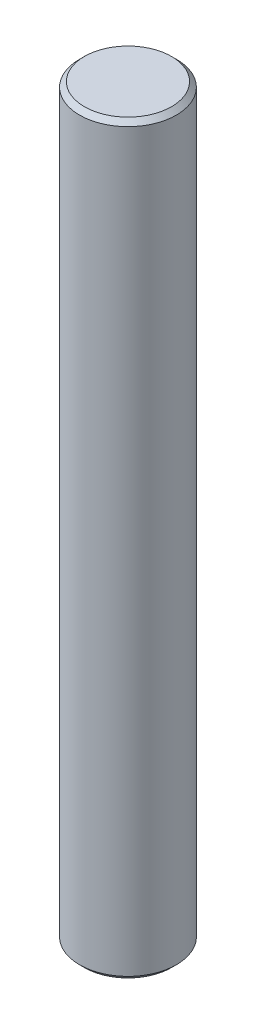
ISO-10303-21;
HEADER;
FILE_DESCRIPTION(('STEP AP214'),'2;1');
FILE_NAME('part.step','',(''),(''),'','','');
FILE_SCHEMA(('AUTOMOTIVE_DESIGN { 1 0 10303 214 1 1 1 1 }'));
ENDSEC;
DATA;
#1=APPLICATION_CONTEXT('core data for automotive mechanical design processes');
#2=APPLICATION_PROTOCOL_DEFINITION('international standard','automotive_design',2000,#1);
#3=PRODUCT_CONTEXT('',#1,'mechanical');
#4=PRODUCT('Part','Part','',(#3));
#5=PRODUCT_RELATED_PRODUCT_CATEGORY('part','',(#4));
#6=PRODUCT_DEFINITION_FORMATION('','',#4);
#7=PRODUCT_DEFINITION_CONTEXT('part definition',#1,'design');
#8=PRODUCT_DEFINITION('design','',#6,#7);
#9=PRODUCT_DEFINITION_SHAPE('','',#8);
#10=(LENGTH_UNIT() NAMED_UNIT(*) SI_UNIT(.MILLI.,.METRE.));
#11=(NAMED_UNIT(*) PLANE_ANGLE_UNIT() SI_UNIT($,.RADIAN.));
#12=(NAMED_UNIT(*) SI_UNIT($,.STERADIAN.) SOLID_ANGLE_UNIT());
#13=UNCERTAINTY_MEASURE_WITH_UNIT(LENGTH_MEASURE(1.E-05),#10,'distance_accuracy_value','');
#14=(GEOMETRIC_REPRESENTATION_CONTEXT(3) GLOBAL_UNCERTAINTY_ASSIGNED_CONTEXT((#13)) GLOBAL_UNIT_ASSIGNED_CONTEXT((#10,
#11,#12)) REPRESENTATION_CONTEXT('',''));
#15=CARTESIAN_POINT('',(0.,0.,0.));
#16=DIRECTION('',(0.,0.,1.));
#17=DIRECTION('',(1.,0.,0.));
#18=AXIS2_PLACEMENT_3D('',#15,#16,#17);
#19=CARTESIAN_POINT('',(0.,195.58,0.));
#20=DIRECTION('',(0.,-1.,0.));
#21=DIRECTION('',(0.,0.,-1.));
#22=AXIS2_PLACEMENT_3D('',#19,#20,#21);
#23=CYLINDRICAL_SURFACE('',#22,12.7);
#24=CARTESIAN_POINT('',(0.,194.31,0.));
#25=DIRECTION('',(0.,1.,0.));
#26=DIRECTION('',(0.,0.,1.));
#27=AXIS2_PLACEMENT_3D('',#24,#25,#26);
#28=CIRCLE('',#27,12.7);
#29=CARTESIAN_POINT('',(0.,194.31,12.7));
#30=VERTEX_POINT('',#29);
#31=EDGE_CURVE('E44',#30,#30,#28,.F.);
#32=ORIENTED_EDGE('',*,*,#31,.T.);
#33=EDGE_LOOP('',(#32));
#34=FACE_BOUND('',#33,.T.);
#35=CARTESIAN_POINT('',(0.,1.26999999999999,0.));
#36=DIRECTION('',(0.,1.,0.));
#37=DIRECTION('',(0.,0.,1.));
#38=AXIS2_PLACEMENT_3D('',#35,#36,#37);
#39=CIRCLE('',#38,12.7);
#40=CARTESIAN_POINT('',(0.,1.26999999999999,12.7));
#41=VERTEX_POINT('',#40);
#42=EDGE_CURVE('E48',#41,#41,#39,.T.);
#43=ORIENTED_EDGE('',*,*,#42,.T.);
#44=EDGE_LOOP('',(#43));
#45=FACE_BOUND('',#44,.T.);
#46=ADVANCED_FACE('F36',(#34,#45),#23,.T.);
#47=CARTESIAN_POINT('',(0.,195.58,0.));
#48=DIRECTION('',(0.,1.,0.));
#49=DIRECTION('',(0.,0.,1.));
#50=AXIS2_PLACEMENT_3D('',#47,#48,#49);
#51=PLANE('',#50);
#52=CARTESIAN_POINT('',(0.,195.58,0.));
#53=DIRECTION('',(0.,1.,0.));
#54=DIRECTION('',(0.,0.,1.));
#55=AXIS2_PLACEMENT_3D('',#52,#53,#54);
#56=CIRCLE('',#55,11.43);
#57=CARTESIAN_POINT('',(0.,195.58,11.43));
#58=VERTEX_POINT('',#57);
#59=EDGE_CURVE('E52',#58,#58,#56,.T.);
#60=ORIENTED_EDGE('',*,*,#59,.T.);
#61=EDGE_LOOP('',(#60));
#62=FACE_BOUND('',#61,.T.);
#63=ADVANCED_FACE('F58',(#62),#51,.T.);
#64=CARTESIAN_POINT('',(0.,0.,0.));
#65=DIRECTION('',(0.,1.,0.));
#66=DIRECTION('',(0.,0.,1.));
#67=AXIS2_PLACEMENT_3D('',#64,#65,#66);
#68=PLANE('',#67);
#69=CARTESIAN_POINT('',(0.,0.,0.));
#70=DIRECTION('',(0.,1.,0.));
#71=DIRECTION('',(0.,0.,1.));
#72=AXIS2_PLACEMENT_3D('',#69,#70,#71);
#73=CIRCLE('',#72,11.43);
#74=CARTESIAN_POINT('',(0.,0.,11.43));
#75=VERTEX_POINT('',#74);
#76=EDGE_CURVE('E10',#75,#75,#73,.F.);
#77=ORIENTED_EDGE('',*,*,#76,.T.);
#78=EDGE_LOOP('',(#77));
#79=FACE_BOUND('',#78,.T.);
#80=ADVANCED_FACE('F62',(#79),#68,.F.);
#81=CARTESIAN_POINT('',(0.,195.58,0.));
#82=DIRECTION('',(0.,-1.,0.));
#83=DIRECTION('',(0.,0.,-1.));
#84=AXIS2_PLACEMENT_3D('',#81,#82,#83);
#85=CONICAL_SURFACE('',#84,11.43,0.785398163397442);
#86=ORIENTED_EDGE('',*,*,#31,.F.);
#87=EDGE_LOOP('',(#86));
#88=FACE_BOUND('',#87,.T.);
#89=ORIENTED_EDGE('',*,*,#59,.F.);
#90=EDGE_LOOP('',(#89));
#91=FACE_BOUND('',#90,.T.);
#92=ADVANCED_FACE('F60',(#88,#91),#85,.T.);
#93=CARTESIAN_POINT('',(0.,1.26999999999999,0.));
#94=DIRECTION('',(0.,1.,0.));
#95=DIRECTION('',(0.,0.,1.));
#96=AXIS2_PLACEMENT_3D('',#93,#94,#95);
#97=CONICAL_SURFACE('',#96,12.7,0.785398163397452);
#98=ORIENTED_EDGE('',*,*,#76,.F.);
#99=EDGE_LOOP('',(#98));
#100=FACE_BOUND('',#99,.T.);
#101=ORIENTED_EDGE('',*,*,#42,.F.);
#102=EDGE_LOOP('',(#101));
#103=FACE_BOUND('',#102,.T.);
#104=ADVANCED_FACE('F39',(#100,#103),#97,.T.);
#105=CLOSED_SHELL('',(#46,#63,#80,#92,#104));
#106=MANIFOLD_SOLID_BREP('B2',#105);
#107=ADVANCED_BREP_SHAPE_REPRESENTATION('',(#18,#106),#14);
#108=SHAPE_DEFINITION_REPRESENTATION(#9,#107);
ENDSEC;
END-ISO-10303-21;
